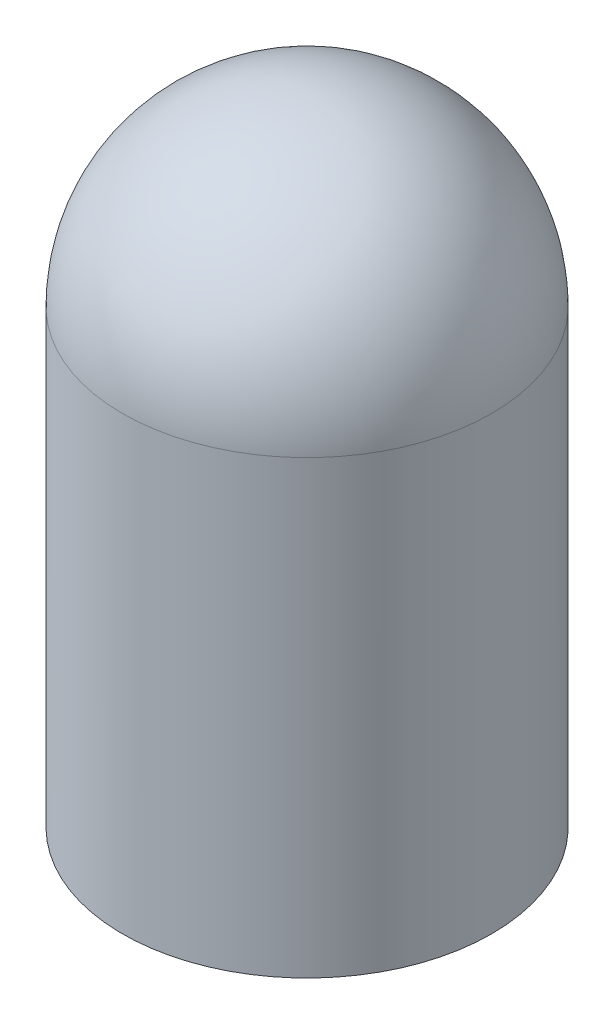
ISO-10303-21;
HEADER;
FILE_DESCRIPTION(('STEP AP214'),'2;1');
FILE_NAME('part.step','',(''),(''),'','','');
FILE_SCHEMA(('AUTOMOTIVE_DESIGN { 1 0 10303 214 1 1 1 1 }'));
ENDSEC;
DATA;
#1=APPLICATION_CONTEXT('core data for automotive mechanical design processes');
#2=APPLICATION_PROTOCOL_DEFINITION('international standard','automotive_design',2000,#1);
#3=PRODUCT_CONTEXT('',#1,'mechanical');
#4=PRODUCT('Part','Part','',(#3));
#5=PRODUCT_RELATED_PRODUCT_CATEGORY('part','',(#4));
#6=PRODUCT_DEFINITION_FORMATION('','',#4);
#7=PRODUCT_DEFINITION_CONTEXT('part definition',#1,'design');
#8=PRODUCT_DEFINITION('design','',#6,#7);
#9=PRODUCT_DEFINITION_SHAPE('','',#8);
#10=(LENGTH_UNIT() NAMED_UNIT(*) SI_UNIT(.MILLI.,.METRE.));
#11=(NAMED_UNIT(*) PLANE_ANGLE_UNIT() SI_UNIT($,.RADIAN.));
#12=(NAMED_UNIT(*) SI_UNIT($,.STERADIAN.) SOLID_ANGLE_UNIT());
#13=UNCERTAINTY_MEASURE_WITH_UNIT(LENGTH_MEASURE(1.E-05),#10,'distance_accuracy_value','');
#14=(GEOMETRIC_REPRESENTATION_CONTEXT(3) GLOBAL_UNCERTAINTY_ASSIGNED_CONTEXT((#13)) GLOBAL_UNIT_ASSIGNED_CONTEXT((#10,
#11,#12)) REPRESENTATION_CONTEXT('',''));
#15=CARTESIAN_POINT('',(0.,0.,0.));
#16=DIRECTION('',(0.,0.,1.));
#17=DIRECTION('',(1.,0.,0.));
#18=AXIS2_PLACEMENT_3D('',#15,#16,#17);
#19=CARTESIAN_POINT('',(-2.5319228,1.016,-2.5319228));
#20=DIRECTION('',(0.,1.,0.));
#21=DIRECTION('',(0.,0.,1.));
#22=AXIS2_PLACEMENT_3D('',#19,#20,#21);
#23=PLANE('',#22);
#24=CARTESIAN_POINT('',(0.,1.016,0.));
#25=DIRECTION('',(0.,-1.,0.));
#26=DIRECTION('',(1.,0.,0.));
#27=AXIS2_PLACEMENT_3D('',#24,#25,#26);
#28=CIRCLE('',#27,2.5019);
#29=CARTESIAN_POINT('',(2.5019,1.016,0.));
#30=VERTEX_POINT('',#29);
#31=EDGE_CURVE('E19',#30,#30,#28,.T.);
#32=ORIENTED_EDGE('',*,*,#31,.T.);
#33=EDGE_LOOP('',(#32));
#34=FACE_BOUND('',#33,.T.);
#35=ADVANCED_FACE('F16',(#34),#23,.F.);
#36=CARTESIAN_POINT('',(0.,7.1247,0.));
#37=DIRECTION('',(0.,0.,1.));
#38=DIRECTION('',(-1.,0.,0.));
#39=AXIS2_PLACEMENT_3D('',#36,#37,#38);
#40=SPHERICAL_SURFACE('',#39,2.5019);
#41=CARTESIAN_POINT('',(0.,7.1247,0.));
#42=DIRECTION('',(-4.10206857030662E-10,1.,0.));
#43=DIRECTION('',(0.,0.,-1.));
#44=AXIS2_PLACEMENT_3D('',#41,#42,#43);
#45=CIRCLE('',#44,2.5019);
#46=CARTESIAN_POINT('',(3.14353089745611E-09,7.1247,2.5019));
#47=VERTEX_POINT('',#46);
#48=CARTESIAN_POINT('',(0.,7.1247,-2.5019));
#49=VERTEX_POINT('',#48);
#50=EDGE_CURVE('E29',#47,#49,#45,.F.);
#51=ORIENTED_EDGE('',*,*,#50,.F.);
#52=CARTESIAN_POINT('',(0.,7.1247,0.));
#53=DIRECTION('',(0.,-1.,0.));
#54=DIRECTION('',(0.,0.,-1.));
#55=AXIS2_PLACEMENT_3D('',#52,#53,#54);
#56=CIRCLE('',#55,2.5019);
#57=EDGE_CURVE('E10',#47,#49,#56,.F.);
#58=ORIENTED_EDGE('',*,*,#57,.T.);
#59=EDGE_LOOP('',(#51,#58));
#60=FACE_BOUND('',#59,.T.);
#61=ADVANCED_FACE('F34',(#60),#40,.T.);
#62=CARTESIAN_POINT('',(0.,7.1247,0.));
#63=DIRECTION('',(0.,-1.,0.));
#64=DIRECTION('',(1.,0.,0.));
#65=AXIS2_PLACEMENT_3D('',#62,#63,#64);
#66=CYLINDRICAL_SURFACE('',#65,2.5019);
#67=ORIENTED_EDGE('',*,*,#31,.F.);
#68=EDGE_LOOP('',(#67));
#69=FACE_BOUND('',#68,.T.);
#70=ORIENTED_EDGE('',*,*,#57,.F.);
#71=ORIENTED_EDGE('',*,*,#50,.T.);
#72=EDGE_LOOP('',(#70,#71));
#73=FACE_BOUND('',#72,.T.);
#74=ADVANCED_FACE('F32',(#69,#73),#66,.T.);
#75=CLOSED_SHELL('',(#35,#61,#74));
#76=MANIFOLD_SOLID_BREP('B1',#75);
#77=ADVANCED_BREP_SHAPE_REPRESENTATION('',(#18,#76),#14);
#78=SHAPE_DEFINITION_REPRESENTATION(#9,#77);
ENDSEC;
END-ISO-10303-21;
